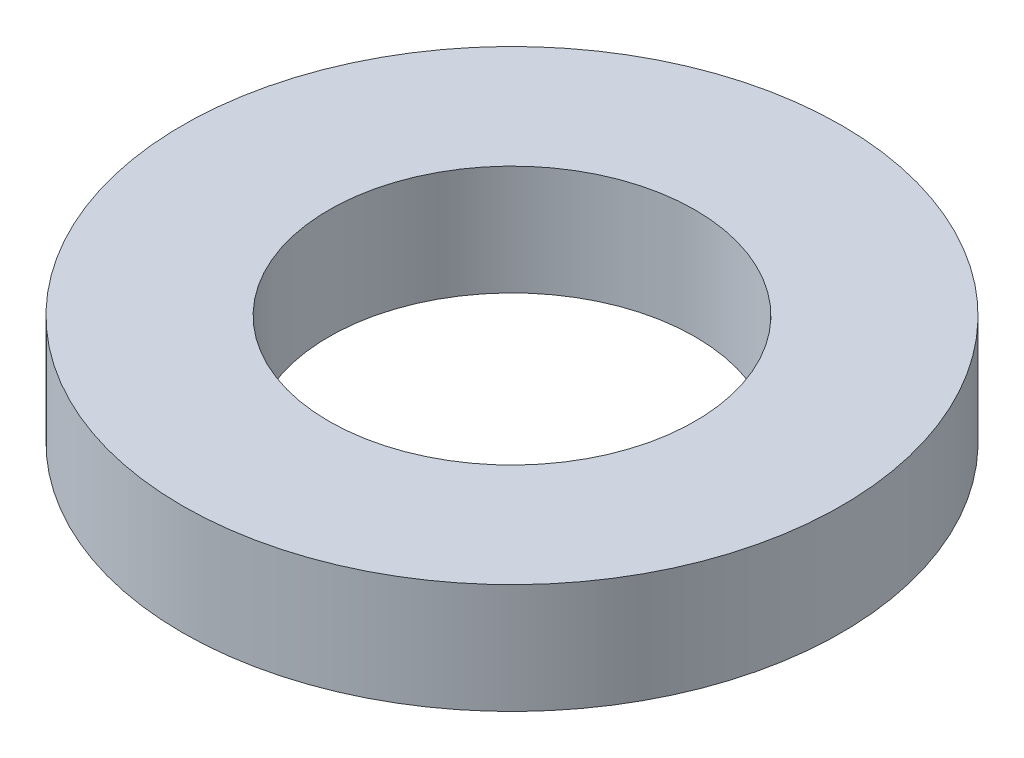
ISO-10303-21;
HEADER;
FILE_DESCRIPTION(('STEP AP214'),'2;1');
FILE_NAME('part.step','',(''),(''),'','','');
FILE_SCHEMA(('AUTOMOTIVE_DESIGN { 1 0 10303 214 1 1 1 1 }'));
ENDSEC;
DATA;
#1=APPLICATION_CONTEXT('core data for automotive mechanical design processes');
#2=APPLICATION_PROTOCOL_DEFINITION('international standard','automotive_design',2000,#1);
#3=PRODUCT_CONTEXT('',#1,'mechanical');
#4=PRODUCT('Part','Part','',(#3));
#5=PRODUCT_RELATED_PRODUCT_CATEGORY('part','',(#4));
#6=PRODUCT_DEFINITION_FORMATION('','',#4);
#7=PRODUCT_DEFINITION_CONTEXT('part definition',#1,'design');
#8=PRODUCT_DEFINITION('design','',#6,#7);
#9=PRODUCT_DEFINITION_SHAPE('','',#8);
#10=(LENGTH_UNIT() NAMED_UNIT(*) SI_UNIT(.MILLI.,.METRE.));
#11=(NAMED_UNIT(*) PLANE_ANGLE_UNIT() SI_UNIT($,.RADIAN.));
#12=(NAMED_UNIT(*) SI_UNIT($,.STERADIAN.) SOLID_ANGLE_UNIT());
#13=UNCERTAINTY_MEASURE_WITH_UNIT(LENGTH_MEASURE(1.E-05),#10,'distance_accuracy_value','');
#14=(GEOMETRIC_REPRESENTATION_CONTEXT(3) GLOBAL_UNCERTAINTY_ASSIGNED_CONTEXT((#13)) GLOBAL_UNIT_ASSIGNED_CONTEXT((#10,
#11,#12)) REPRESENTATION_CONTEXT('',''));
#15=CARTESIAN_POINT('',(0.,0.,0.));
#16=DIRECTION('',(0.,0.,1.));
#17=DIRECTION('',(1.,0.,0.));
#18=AXIS2_PLACEMENT_3D('',#15,#16,#17);
#19=CARTESIAN_POINT('',(0.,3.,0.));
#20=DIRECTION('',(0.,1.,0.));
#21=DIRECTION('',(0.,0.,1.));
#22=AXIS2_PLACEMENT_3D('',#19,#20,#21);
#23=PLANE('',#22);
#24=CARTESIAN_POINT('',(0.,3.,0.));
#25=DIRECTION('',(0.,1.,0.));
#26=DIRECTION('',(0.,0.,1.));
#27=AXIS2_PLACEMENT_3D('',#24,#25,#26);
#28=CIRCLE('',#27,9.);
#29=CARTESIAN_POINT('',(0.,3.,9.));
#30=VERTEX_POINT('',#29);
#31=EDGE_CURVE('E10',#30,#30,#28,.T.);
#32=ORIENTED_EDGE('',*,*,#31,.T.);
#33=EDGE_LOOP('',(#32));
#34=FACE_BOUND('',#33,.T.);
#35=CARTESIAN_POINT('',(0.,3.,0.));
#36=DIRECTION('',(0.,1.,0.));
#37=DIRECTION('',(0.,0.,1.));
#38=AXIS2_PLACEMENT_3D('',#35,#36,#37);
#39=CIRCLE('',#38,5.);
#40=CARTESIAN_POINT('',(0.,3.,5.));
#41=VERTEX_POINT('',#40);
#42=EDGE_CURVE('E48',#41,#41,#39,.T.);
#43=ORIENTED_EDGE('',*,*,#42,.F.);
#44=EDGE_LOOP('',(#43));
#45=FACE_BOUND('',#44,.T.);
#46=ADVANCED_FACE('F37',(#34,#45),#23,.T.);
#47=CARTESIAN_POINT('',(0.,0.,0.));
#48=DIRECTION('',(0.,1.,0.));
#49=DIRECTION('',(0.,0.,1.));
#50=AXIS2_PLACEMENT_3D('',#47,#48,#49);
#51=PLANE('',#50);
#52=CARTESIAN_POINT('',(0.,0.,0.));
#53=DIRECTION('',(0.,1.,0.));
#54=DIRECTION('',(0.,0.,1.));
#55=AXIS2_PLACEMENT_3D('',#52,#53,#54);
#56=CIRCLE('',#55,9.);
#57=CARTESIAN_POINT('',(0.,0.,9.));
#58=VERTEX_POINT('',#57);
#59=EDGE_CURVE('E41',#58,#58,#56,.T.);
#60=ORIENTED_EDGE('',*,*,#59,.F.);
#61=EDGE_LOOP('',(#60));
#62=FACE_BOUND('',#61,.T.);
#63=CARTESIAN_POINT('',(0.,0.,0.));
#64=DIRECTION('',(0.,1.,0.));
#65=DIRECTION('',(0.,0.,1.));
#66=AXIS2_PLACEMENT_3D('',#63,#64,#65);
#67=CIRCLE('',#66,5.);
#68=CARTESIAN_POINT('',(0.,0.,5.));
#69=VERTEX_POINT('',#68);
#70=EDGE_CURVE('E50',#69,#69,#67,.T.);
#71=ORIENTED_EDGE('',*,*,#70,.T.);
#72=EDGE_LOOP('',(#71));
#73=FACE_BOUND('',#72,.T.);
#74=ADVANCED_FACE('F60',(#62,#73),#51,.F.);
#75=CARTESIAN_POINT('',(0.,3.,0.));
#76=DIRECTION('',(0.,-1.,0.));
#77=DIRECTION('',(0.,0.,-1.));
#78=AXIS2_PLACEMENT_3D('',#75,#76,#77);
#79=CYLINDRICAL_SURFACE('',#78,9.);
#80=ORIENTED_EDGE('',*,*,#31,.F.);
#81=EDGE_LOOP('',(#80));
#82=FACE_BOUND('',#81,.T.);
#83=ORIENTED_EDGE('',*,*,#59,.T.);
#84=EDGE_LOOP('',(#83));
#85=FACE_BOUND('',#84,.T.);
#86=ADVANCED_FACE('F39',(#82,#85),#79,.T.);
#87=CARTESIAN_POINT('',(0.,3.,0.));
#88=DIRECTION('',(0.,-1.,0.));
#89=DIRECTION('',(0.,0.,-1.));
#90=AXIS2_PLACEMENT_3D('',#87,#88,#89);
#91=CYLINDRICAL_SURFACE('',#90,5.);
#92=ORIENTED_EDGE('',*,*,#42,.T.);
#93=EDGE_LOOP('',(#92));
#94=FACE_BOUND('',#93,.T.);
#95=ORIENTED_EDGE('',*,*,#70,.F.);
#96=EDGE_LOOP('',(#95));
#97=FACE_BOUND('',#96,.T.);
#98=ADVANCED_FACE('F56',(#94,#97),#91,.F.);
#99=CLOSED_SHELL('',(#46,#74,#86,#98));
#100=MANIFOLD_SOLID_BREP('B2',#99);
#101=ADVANCED_BREP_SHAPE_REPRESENTATION('',(#18,#100),#14);
#102=SHAPE_DEFINITION_REPRESENTATION(#9,#101);
ENDSEC;
END-ISO-10303-21;
